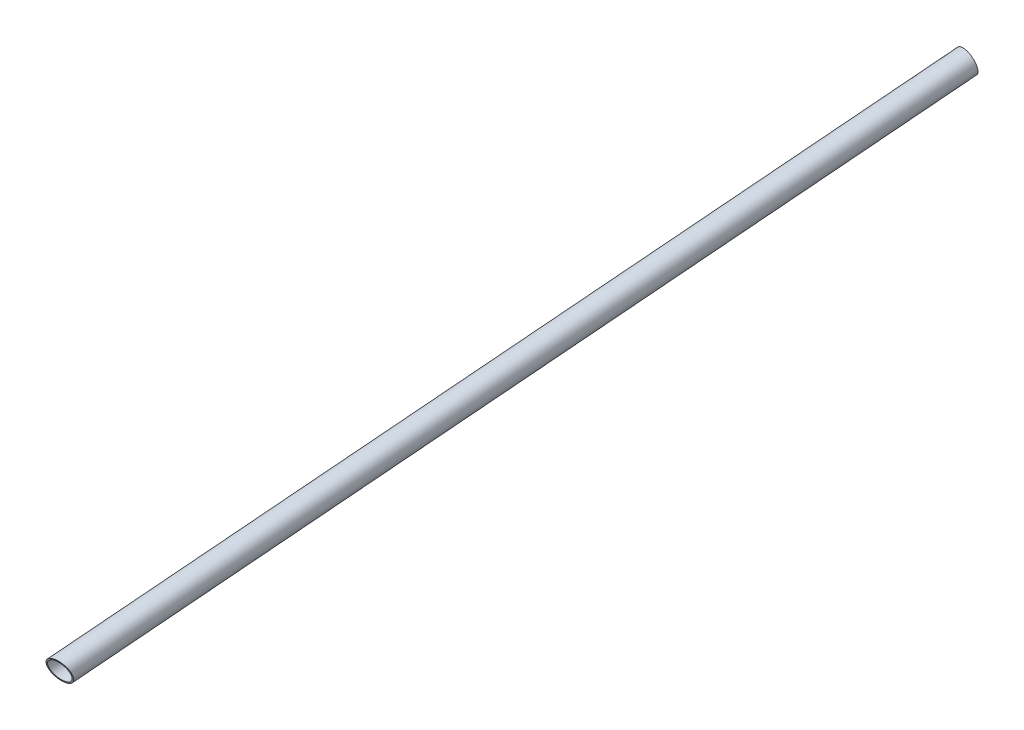
ISO-10303-21;
HEADER;
FILE_DESCRIPTION(('STEP AP214'),'2;1');
FILE_NAME('part.step','',(''),(''),'','','');
FILE_SCHEMA(('AUTOMOTIVE_DESIGN { 1 0 10303 214 1 1 1 1 }'));
ENDSEC;
DATA;
#1=APPLICATION_CONTEXT('core data for automotive mechanical design processes');
#2=APPLICATION_PROTOCOL_DEFINITION('international standard','automotive_design',2000,#1);
#3=PRODUCT_CONTEXT('',#1,'mechanical');
#4=PRODUCT('Part','Part','',(#3));
#5=PRODUCT_RELATED_PRODUCT_CATEGORY('part','',(#4));
#6=PRODUCT_DEFINITION_FORMATION('','',#4);
#7=PRODUCT_DEFINITION_CONTEXT('part definition',#1,'design');
#8=PRODUCT_DEFINITION('design','',#6,#7);
#9=PRODUCT_DEFINITION_SHAPE('','',#8);
#10=(LENGTH_UNIT() NAMED_UNIT(*) SI_UNIT(.MILLI.,.METRE.));
#11=(NAMED_UNIT(*) PLANE_ANGLE_UNIT() SI_UNIT($,.RADIAN.));
#12=(NAMED_UNIT(*) SI_UNIT($,.STERADIAN.) SOLID_ANGLE_UNIT());
#13=UNCERTAINTY_MEASURE_WITH_UNIT(LENGTH_MEASURE(1.E-05),#10,'distance_accuracy_value','');
#14=(GEOMETRIC_REPRESENTATION_CONTEXT(3) GLOBAL_UNCERTAINTY_ASSIGNED_CONTEXT((#13)) GLOBAL_UNIT_ASSIGNED_CONTEXT((#10,
#11,#12)) REPRESENTATION_CONTEXT('',''));
#15=CARTESIAN_POINT('',(0.,0.,0.));
#16=DIRECTION('',(0.,0.,1.));
#17=DIRECTION('',(1.,0.,0.));
#18=AXIS2_PLACEMENT_3D('',#15,#16,#17);
#19=CARTESIAN_POINT('',(150.,500.,-1140.));
#20=DIRECTION('',(-0.125768324689571,-0.215602842324979,0.968347945155133));
#21=DIRECTION('',(0.,-0.976098519192531,-0.21732850901377));
#22=AXIS2_PLACEMENT_3D('',#19,#20,#21);
#23=CYLINDRICAL_SURFACE('',#22,7.1);
#24=CARTESIAN_POINT('',(150.,500.,-1140.));
#25=DIRECTION('',(0.125768324689571,0.215602842324979,-0.968347945155133));
#26=DIRECTION('',(0.500263993198956,-0.856690297373219,-0.125768324689571));
#27=AXIS2_PLACEMENT_3D('',#24,#25,#26);
#28=CIRCLE('',#27,7.1);
#29=CARTESIAN_POINT('',(153.551874351713,493.91749888865,-1140.8929551053));
#30=VERTEX_POINT('',#29);
#31=EDGE_CURVE('E53',#30,#30,#28,.T.);
#32=ORIENTED_EDGE('',*,*,#31,.T.);
#33=EDGE_LOOP('',(#32));
#34=FACE_BOUND('',#33,.T.);
#35=CARTESIAN_POINT('',(80.,380.,-601.037933611912));
#36=DIRECTION('',(0.0966021654991002,-0.31145037677638,0.945339454601751));
#37=DIRECTION('',(-0.909209641489906,0.358833563956318,0.211131004829238));
#38=AXIS2_PLACEMENT_3D('',#35,#36,#37);
#39=ELLIPSE('',#38,7.31643769653913,7.1);
#40=CARTESIAN_POINT('',(73.3478243049464,382.625383414114,-599.493206769271));
#41=VERTEX_POINT('',#40);
#42=EDGE_CURVE('E43',#41,#41,#39,.T.);
#43=ORIENTED_EDGE('',*,*,#42,.T.);
#44=EDGE_LOOP('',(#43));
#45=FACE_BOUND('',#44,.T.);
#46=ADVANCED_FACE('F39',(#34,#45),#23,.F.);
#47=CARTESIAN_POINT('',(150.,500.,-1140.));
#48=DIRECTION('',(-0.125768324689571,-0.215602842324979,0.968347945155133));
#49=DIRECTION('',(0.,-0.976098519192531,-0.21732850901377));
#50=AXIS2_PLACEMENT_3D('',#47,#48,#49);
#51=CYLINDRICAL_SURFACE('',#50,8.);
#52=CARTESIAN_POINT('',(150.,500.,-1140.));
#53=DIRECTION('',(0.125768324689571,0.215602842324979,-0.968347945155133));
#54=DIRECTION('',(0.500263993198956,-0.856690297373219,-0.125768324689571));
#55=AXIS2_PLACEMENT_3D('',#52,#53,#54);
#56=CIRCLE('',#55,8.);
#57=CARTESIAN_POINT('',(154.002111945592,493.146477621014,-1141.00614659752));
#58=VERTEX_POINT('',#57);
#59=EDGE_CURVE('E47',#58,#58,#56,.T.);
#60=ORIENTED_EDGE('',*,*,#59,.F.);
#61=EDGE_LOOP('',(#60));
#62=FACE_BOUND('',#61,.T.);
#63=CARTESIAN_POINT('',(80.,380.,-601.037933611912));
#64=DIRECTION('',(0.0966021654991002,-0.31145037677638,0.945339454601751));
#65=DIRECTION('',(-0.909209641489906,0.358833563956318,0.211131004829238));
#66=AXIS2_PLACEMENT_3D('',#63,#64,#65);
#67=ELLIPSE('',#66,8.24387346088917,8.);
#68=CARTESIAN_POINT('',(72.5045907661368,382.958178494776,-599.297396324429));
#69=VERTEX_POINT('',#68);
#70=EDGE_CURVE('E10',#69,#69,#67,.T.);
#71=ORIENTED_EDGE('',*,*,#70,.F.);
#72=EDGE_LOOP('',(#71));
#73=FACE_BOUND('',#72,.T.);
#74=ADVANCED_FACE('F67',(#62,#73),#51,.T.);
#75=CARTESIAN_POINT('',(150.,500.,-1140.));
#76=DIRECTION('',(0.125768324689571,0.215602842324979,-0.968347945155133));
#77=DIRECTION('',(0.500263993198956,-0.856690297373219,-0.125768324689571));
#78=AXIS2_PLACEMENT_3D('',#75,#76,#77);
#79=PLANE('',#78);
#80=ORIENTED_EDGE('',*,*,#31,.F.);
#81=EDGE_LOOP('',(#80));
#82=FACE_BOUND('',#81,.T.);
#83=ORIENTED_EDGE('',*,*,#59,.T.);
#84=EDGE_LOOP('',(#83));
#85=FACE_BOUND('',#84,.T.);
#86=ADVANCED_FACE('F62',(#82,#85),#79,.T.);
#87=CARTESIAN_POINT('',(80.,380.,-601.037933611912));
#88=DIRECTION('',(0.0966021654991002,-0.31145037677638,0.945339454601751));
#89=DIRECTION('',(0.,-0.949781512459289,-0.312913851707695));
#90=AXIS2_PLACEMENT_3D('',#87,#88,#89);
#91=PLANE('',#90);
#92=ORIENTED_EDGE('',*,*,#42,.F.);
#93=EDGE_LOOP('',(#92));
#94=FACE_BOUND('',#93,.T.);
#95=ORIENTED_EDGE('',*,*,#70,.T.);
#96=EDGE_LOOP('',(#95));
#97=FACE_BOUND('',#96,.T.);
#98=ADVANCED_FACE('F41',(#94,#97),#91,.T.);
#99=CLOSED_SHELL('',(#46,#74,#86,#98));
#100=MANIFOLD_SOLID_BREP('B2',#99);
#101=ADVANCED_BREP_SHAPE_REPRESENTATION('',(#18,#100),#14);
#102=SHAPE_DEFINITION_REPRESENTATION(#9,#101);
ENDSEC;
END-ISO-10303-21;
